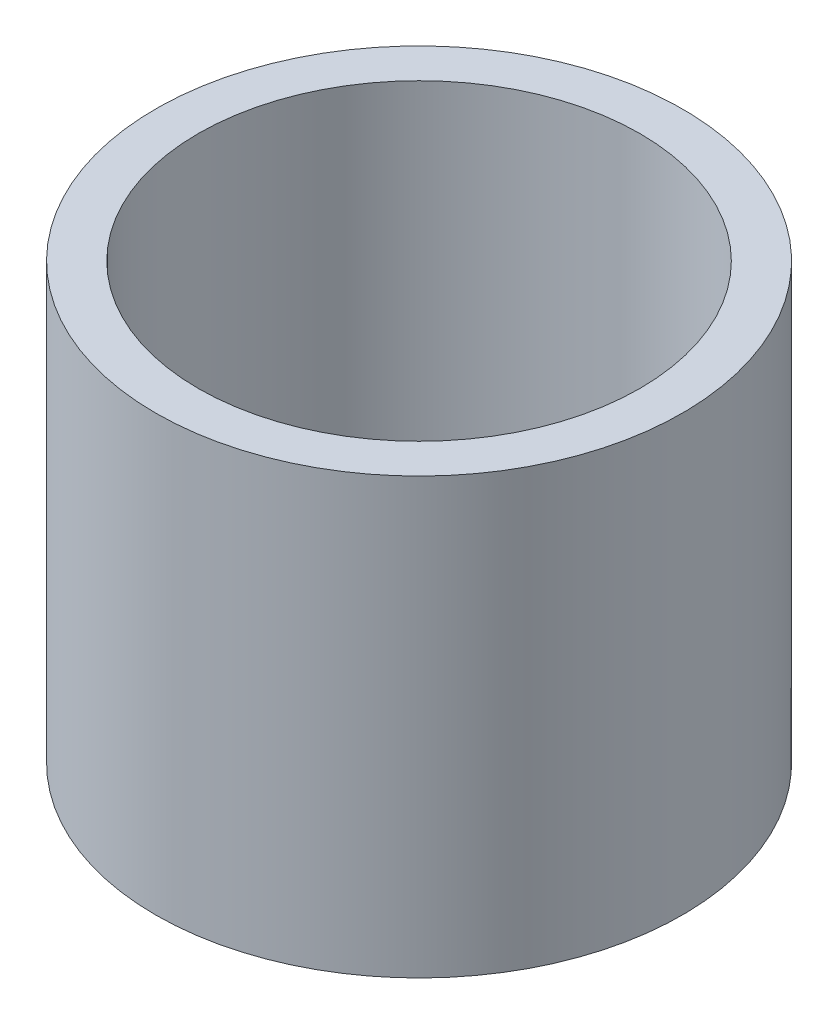
ISO-10303-21;
HEADER;
FILE_DESCRIPTION(('STEP AP214'),'2;1');
FILE_NAME('part.step','',(''),(''),'','','');
FILE_SCHEMA(('AUTOMOTIVE_DESIGN { 1 0 10303 214 1 1 1 1 }'));
ENDSEC;
DATA;
#1=APPLICATION_CONTEXT('core data for automotive mechanical design processes');
#2=APPLICATION_PROTOCOL_DEFINITION('international standard','automotive_design',2000,#1);
#3=PRODUCT_CONTEXT('',#1,'mechanical');
#4=PRODUCT('Part','Part','',(#3));
#5=PRODUCT_RELATED_PRODUCT_CATEGORY('part','',(#4));
#6=PRODUCT_DEFINITION_FORMATION('','',#4);
#7=PRODUCT_DEFINITION_CONTEXT('part definition',#1,'design');
#8=PRODUCT_DEFINITION('design','',#6,#7);
#9=PRODUCT_DEFINITION_SHAPE('','',#8);
#10=(LENGTH_UNIT() NAMED_UNIT(*) SI_UNIT(.MILLI.,.METRE.));
#11=(NAMED_UNIT(*) PLANE_ANGLE_UNIT() SI_UNIT($,.RADIAN.));
#12=(NAMED_UNIT(*) SI_UNIT($,.STERADIAN.) SOLID_ANGLE_UNIT());
#13=UNCERTAINTY_MEASURE_WITH_UNIT(LENGTH_MEASURE(1.E-05),#10,'distance_accuracy_value','');
#14=(GEOMETRIC_REPRESENTATION_CONTEXT(3) GLOBAL_UNCERTAINTY_ASSIGNED_CONTEXT((#13)) GLOBAL_UNIT_ASSIGNED_CONTEXT((#10,
#11,#12)) REPRESENTATION_CONTEXT('',''));
#15=CARTESIAN_POINT('',(0.,0.,0.));
#16=DIRECTION('',(0.,0.,1.));
#17=DIRECTION('',(1.,0.,0.));
#18=AXIS2_PLACEMENT_3D('',#15,#16,#17);
#19=CARTESIAN_POINT('',(0.,50.,0.));
#20=DIRECTION('',(0.,1.,0.));
#21=DIRECTION('',(0.,0.,1.));
#22=AXIS2_PLACEMENT_3D('',#19,#20,#21);
#23=PLANE('',#22);
#24=CARTESIAN_POINT('',(0.,50.,0.));
#25=DIRECTION('',(0.,1.,0.));
#26=DIRECTION('',(0.,0.,1.));
#27=AXIS2_PLACEMENT_3D('',#24,#25,#26);
#28=CIRCLE('',#27,30.3);
#29=CARTESIAN_POINT('',(0.,50.,30.3));
#30=VERTEX_POINT('',#29);
#31=EDGE_CURVE('E10',#30,#30,#28,.T.);
#32=ORIENTED_EDGE('',*,*,#31,.T.);
#33=EDGE_LOOP('',(#32));
#34=FACE_BOUND('',#33,.T.);
#35=CARTESIAN_POINT('',(0.,50.,0.));
#36=DIRECTION('',(0.,1.,0.));
#37=DIRECTION('',(0.,0.,1.));
#38=AXIS2_PLACEMENT_3D('',#35,#36,#37);
#39=CIRCLE('',#38,25.4);
#40=CARTESIAN_POINT('',(0.,50.,25.4));
#41=VERTEX_POINT('',#40);
#42=EDGE_CURVE('E54',#41,#41,#39,.T.);
#43=ORIENTED_EDGE('',*,*,#42,.F.);
#44=EDGE_LOOP('',(#43));
#45=FACE_BOUND('',#44,.T.);
#46=ADVANCED_FACE('F41',(#34,#45),#23,.T.);
#47=CARTESIAN_POINT('',(0.,0.,0.));
#48=DIRECTION('',(0.,1.,0.));
#49=DIRECTION('',(0.,0.,1.));
#50=AXIS2_PLACEMENT_3D('',#47,#48,#49);
#51=PLANE('',#50);
#52=CARTESIAN_POINT('',(0.,0.,0.));
#53=DIRECTION('',(0.,1.,0.));
#54=DIRECTION('',(0.,0.,1.));
#55=AXIS2_PLACEMENT_3D('',#52,#53,#54);
#56=CIRCLE('',#55,30.3);
#57=CARTESIAN_POINT('',(0.,0.,30.3));
#58=VERTEX_POINT('',#57);
#59=EDGE_CURVE('E45',#58,#58,#56,.T.);
#60=ORIENTED_EDGE('',*,*,#59,.F.);
#61=EDGE_LOOP('',(#60));
#62=FACE_BOUND('',#61,.T.);
#63=CARTESIAN_POINT('',(0.,0.,0.));
#64=DIRECTION('',(0.,1.,0.));
#65=DIRECTION('',(0.,0.,1.));
#66=AXIS2_PLACEMENT_3D('',#63,#64,#65);
#67=CIRCLE('',#66,25.4);
#68=CARTESIAN_POINT('',(0.,0.,25.4));
#69=VERTEX_POINT('',#68);
#70=EDGE_CURVE('E56',#69,#69,#67,.T.);
#71=ORIENTED_EDGE('',*,*,#70,.T.);
#72=EDGE_LOOP('',(#71));
#73=FACE_BOUND('',#72,.T.);
#74=ADVANCED_FACE('F68',(#62,#73),#51,.F.);
#75=CARTESIAN_POINT('',(0.,50.,0.));
#76=DIRECTION('',(0.,-1.,0.));
#77=DIRECTION('',(0.,0.,-1.));
#78=AXIS2_PLACEMENT_3D('',#75,#76,#77);
#79=CYLINDRICAL_SURFACE('',#78,30.3);
#80=ORIENTED_EDGE('',*,*,#31,.F.);
#81=EDGE_LOOP('',(#80));
#82=FACE_BOUND('',#81,.T.);
#83=ORIENTED_EDGE('',*,*,#59,.T.);
#84=EDGE_LOOP('',(#83));
#85=FACE_BOUND('',#84,.T.);
#86=ADVANCED_FACE('F43',(#82,#85),#79,.T.);
#87=CARTESIAN_POINT('',(0.,50.,0.));
#88=DIRECTION('',(0.,-1.,0.));
#89=DIRECTION('',(0.,0.,-1.));
#90=AXIS2_PLACEMENT_3D('',#87,#88,#89);
#91=CYLINDRICAL_SURFACE('',#90,25.4);
#92=ORIENTED_EDGE('',*,*,#42,.T.);
#93=EDGE_LOOP('',(#92));
#94=FACE_BOUND('',#93,.T.);
#95=ORIENTED_EDGE('',*,*,#70,.F.);
#96=EDGE_LOOP('',(#95));
#97=FACE_BOUND('',#96,.T.);
#98=ADVANCED_FACE('F64',(#94,#97),#91,.F.);
#99=CLOSED_SHELL('',(#46,#74,#86,#98));
#100=MANIFOLD_SOLID_BREP('B2',#99);
#101=ADVANCED_BREP_SHAPE_REPRESENTATION('',(#18,#100),#14);
#102=SHAPE_DEFINITION_REPRESENTATION(#9,#101);
ENDSEC;
END-ISO-10303-21;
